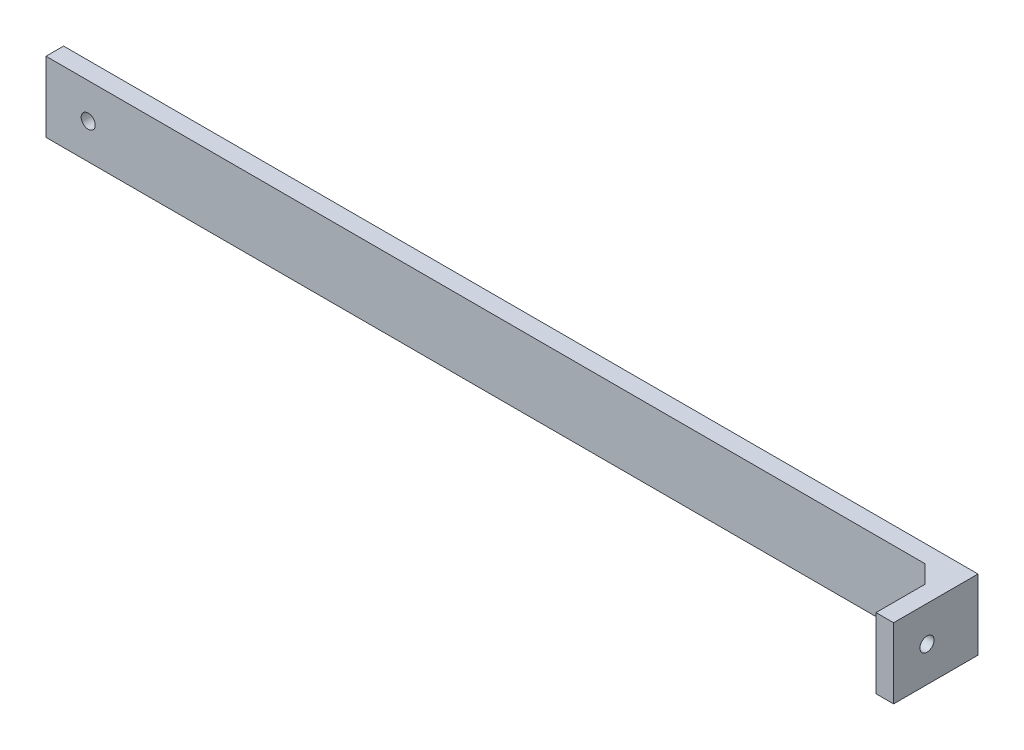
ISO-10303-21;
HEADER;
FILE_DESCRIPTION(('STEP AP214'),'2;1');
FILE_NAME('part.step','',(''),(''),'','','');
FILE_SCHEMA(('AUTOMOTIVE_DESIGN { 1 0 10303 214 1 1 1 1 }'));
ENDSEC;
DATA;
#1=APPLICATION_CONTEXT('core data for automotive mechanical design processes');
#2=APPLICATION_PROTOCOL_DEFINITION('international standard','automotive_design',2000,#1);
#3=PRODUCT_CONTEXT('',#1,'mechanical');
#4=PRODUCT('Part','Part','',(#3));
#5=PRODUCT_RELATED_PRODUCT_CATEGORY('part','',(#4));
#6=PRODUCT_DEFINITION_FORMATION('','',#4);
#7=PRODUCT_DEFINITION_CONTEXT('part definition',#1,'design');
#8=PRODUCT_DEFINITION('design','',#6,#7);
#9=PRODUCT_DEFINITION_SHAPE('','',#8);
#10=(LENGTH_UNIT() NAMED_UNIT(*) SI_UNIT(.MILLI.,.METRE.));
#11=(NAMED_UNIT(*) PLANE_ANGLE_UNIT() SI_UNIT($,.RADIAN.));
#12=(NAMED_UNIT(*) SI_UNIT($,.STERADIAN.) SOLID_ANGLE_UNIT());
#13=UNCERTAINTY_MEASURE_WITH_UNIT(LENGTH_MEASURE(1.E-05),#10,'distance_accuracy_value','');
#14=(GEOMETRIC_REPRESENTATION_CONTEXT(3) GLOBAL_UNCERTAINTY_ASSIGNED_CONTEXT((#13)) GLOBAL_UNIT_ASSIGNED_CONTEXT((#10,
#11,#12)) REPRESENTATION_CONTEXT('',''));
#15=CARTESIAN_POINT('',(0.,0.,0.));
#16=DIRECTION('',(0.,0.,1.));
#17=DIRECTION('',(1.,0.,0.));
#18=AXIS2_PLACEMENT_3D('',#15,#16,#17);
#19=CARTESIAN_POINT('',(0.,0.,5.));
#20=DIRECTION('',(0.,0.,-1.));
#21=DIRECTION('',(-1.,0.,0.));
#22=AXIS2_PLACEMENT_3D('',#19,#20,#21);
#23=PLANE('',#22);
#24=CARTESIAN_POINT('',(-118.,0.,5.));
#25=DIRECTION('',(0.,0.,-1.));
#26=DIRECTION('',(-1.,0.,0.));
#27=AXIS2_PLACEMENT_3D('',#24,#25,#26);
#28=CIRCLE('',#27,2.);
#29=CARTESIAN_POINT('',(-120.,0.,5.));
#30=VERTEX_POINT('',#29);
#31=EDGE_CURVE('E355',#30,#30,#28,.T.);
#32=ORIENTED_EDGE('',*,*,#31,.T.);
#33=EDGE_LOOP('',(#32));
#34=FACE_BOUND('',#33,.T.);
#35=DIRECTION('',(1.,0.,0.));
#36=VECTOR('',#35,1.);
#37=CARTESIAN_POINT('',(120.,5.,5.));
#38=LINE('',#37,#36);
#39=CARTESIAN_POINT('',(120.,5.,5.));
#40=VERTEX_POINT('',#39);
#41=CARTESIAN_POINT('',(125.,5.,5.));
#42=VERTEX_POINT('',#41);
#43=EDGE_CURVE('E201',#40,#42,#38,.T.);
#44=ORIENTED_EDGE('',*,*,#43,.F.);
#45=DIRECTION('',(0.,-1.,0.));
#46=VECTOR('',#45,1.);
#47=CARTESIAN_POINT('',(120.,10.,5.));
#48=LINE('',#47,#46);
#49=CARTESIAN_POINT('',(120.,10.,5.));
#50=VERTEX_POINT('',#49);
#51=EDGE_CURVE('E118',#50,#40,#48,.T.);
#52=ORIENTED_EDGE('',*,*,#51,.F.);
#53=DIRECTION('',(-1.,0.,0.));
#54=VECTOR('',#53,1.);
#55=CARTESIAN_POINT('',(-130.,10.,5.));
#56=LINE('',#55,#54);
#57=CARTESIAN_POINT('',(-130.,10.,5.));
#58=VERTEX_POINT('',#57);
#59=EDGE_CURVE('E128',#50,#58,#56,.T.);
#60=ORIENTED_EDGE('',*,*,#59,.T.);
#61=DIRECTION('',(0.,-1.,0.));
#62=VECTOR('',#61,1.);
#63=CARTESIAN_POINT('',(-130.,-10.,5.));
#64=LINE('',#63,#62);
#65=CARTESIAN_POINT('',(-130.,-10.,5.));
#66=VERTEX_POINT('',#65);
#67=EDGE_CURVE('E148',#58,#66,#64,.T.);
#68=ORIENTED_EDGE('',*,*,#67,.T.);
#69=DIRECTION('',(1.,0.,0.));
#70=VECTOR('',#69,1.);
#71=CARTESIAN_POINT('',(-130.,-10.,5.));
#72=LINE('',#71,#70);
#73=CARTESIAN_POINT('',(120.,-10.,5.));
#74=VERTEX_POINT('',#73);
#75=EDGE_CURVE('E151',#66,#74,#72,.T.);
#76=ORIENTED_EDGE('',*,*,#75,.T.);
#77=DIRECTION('',(0.,-1.,0.));
#78=VECTOR('',#77,1.);
#79=CARTESIAN_POINT('',(120.,-10.,5.));
#80=LINE('',#79,#78);
#81=CARTESIAN_POINT('',(120.,-5.,5.));
#82=VERTEX_POINT('',#81);
#83=EDGE_CURVE('E203',#82,#74,#80,.T.);
#84=ORIENTED_EDGE('',*,*,#83,.F.);
#85=DIRECTION('',(1.,0.,0.));
#86=VECTOR('',#85,1.);
#87=CARTESIAN_POINT('',(120.,-5.,5.));
#88=LINE('',#87,#86);
#89=CARTESIAN_POINT('',(125.,-5.,5.));
#90=VERTEX_POINT('',#89);
#91=EDGE_CURVE('E208',#82,#90,#88,.T.);
#92=ORIENTED_EDGE('',*,*,#91,.T.);
#93=DIRECTION('',(0.,-1.,0.));
#94=VECTOR('',#93,1.);
#95=CARTESIAN_POINT('',(125.,10.,5.));
#96=LINE('',#95,#94);
#97=EDGE_CURVE('E185',#42,#90,#96,.T.);
#98=ORIENTED_EDGE('',*,*,#97,.F.);
#99=EDGE_LOOP('',(#44,#52,#60,#68,#76,#84,#92,#98));
#100=FACE_BOUND('',#99,.T.);
#101=ADVANCED_FACE('F37',(#34,#100),#23,.F.);
#102=CARTESIAN_POINT('',(125.,10.,24.));
#103=DIRECTION('',(1.,0.,0.));
#104=DIRECTION('',(0.,0.,-1.));
#105=AXIS2_PLACEMENT_3D('',#102,#103,#104);
#106=PLANE('',#105);
#107=DIRECTION('',(0.,0.,-1.));
#108=VECTOR('',#107,1.);
#109=CARTESIAN_POINT('',(125.,-5.,5.));
#110=LINE('',#109,#108);
#111=CARTESIAN_POINT('',(125.,-5.,10.));
#112=VERTEX_POINT('',#111);
#113=EDGE_CURVE('E198',#112,#90,#110,.T.);
#114=ORIENTED_EDGE('',*,*,#113,.F.);
#115=DIRECTION('',(0.,1.,0.));
#116=VECTOR('',#115,1.);
#117=CARTESIAN_POINT('',(125.,-10.,10.));
#118=LINE('',#117,#116);
#119=CARTESIAN_POINT('',(125.,-10.,10.));
#120=VERTEX_POINT('',#119);
#121=EDGE_CURVE('E196',#120,#112,#118,.T.);
#122=ORIENTED_EDGE('',*,*,#121,.F.);
#123=DIRECTION('',(0.,0.,-1.));
#124=VECTOR('',#123,1.);
#125=CARTESIAN_POINT('',(125.,-10.,24.));
#126=LINE('',#125,#124);
#127=CARTESIAN_POINT('',(125.,-10.,24.));
#128=VERTEX_POINT('',#127);
#129=EDGE_CURVE('E137',#128,#120,#126,.T.);
#130=ORIENTED_EDGE('',*,*,#129,.F.);
#131=DIRECTION('',(0.,-1.,0.));
#132=VECTOR('',#131,1.);
#133=CARTESIAN_POINT('',(125.,10.,24.));
#134=LINE('',#133,#132);
#135=CARTESIAN_POINT('',(125.,10.,24.));
#136=VERTEX_POINT('',#135);
#137=EDGE_CURVE('E135',#136,#128,#134,.T.);
#138=ORIENTED_EDGE('',*,*,#137,.F.);
#139=DIRECTION('',(0.,0.,-1.));
#140=VECTOR('',#139,1.);
#141=CARTESIAN_POINT('',(125.,10.,24.));
#142=LINE('',#141,#140);
#143=CARTESIAN_POINT('',(125.,10.,10.));
#144=VERTEX_POINT('',#143);
#145=EDGE_CURVE('E125',#136,#144,#142,.T.);
#146=ORIENTED_EDGE('',*,*,#145,.T.);
#147=DIRECTION('',(0.,1.,0.));
#148=VECTOR('',#147,1.);
#149=CARTESIAN_POINT('',(125.,10.,10.));
#150=LINE('',#149,#148);
#151=CARTESIAN_POINT('',(125.,5.,10.));
#152=VERTEX_POINT('',#151);
#153=EDGE_CURVE('E113',#152,#144,#150,.T.);
#154=ORIENTED_EDGE('',*,*,#153,.F.);
#155=DIRECTION('',(0.,0.,1.));
#156=VECTOR('',#155,1.);
#157=CARTESIAN_POINT('',(125.,5.,5.));
#158=LINE('',#157,#156);
#159=EDGE_CURVE('E53',#42,#152,#158,.T.);
#160=ORIENTED_EDGE('',*,*,#159,.F.);
#161=ORIENTED_EDGE('',*,*,#97,.T.);
#162=EDGE_LOOP('',(#114,#122,#130,#138,#146,#154,#160,#161));
#163=FACE_BOUND('',#162,.T.);
#164=CARTESIAN_POINT('',(125.,0.,14.5));
#165=DIRECTION('',(1.,0.,0.));
#166=DIRECTION('',(0.,0.,-1.));
#167=AXIS2_PLACEMENT_3D('',#164,#165,#166);
#168=CIRCLE('',#167,2.);
#169=CARTESIAN_POINT('',(125.,0.,12.5));
#170=VERTEX_POINT('',#169);
#171=EDGE_CURVE('E41',#170,#170,#168,.T.);
#172=ORIENTED_EDGE('',*,*,#171,.T.);
#173=EDGE_LOOP('',(#172));
#174=FACE_BOUND('',#173,.T.);
#175=ADVANCED_FACE('F132',(#163,#174),#106,.F.);
#176=CARTESIAN_POINT('',(130.,-10.,5.));
#177=DIRECTION('',(-1.,0.,0.));
#178=DIRECTION('',(0.,0.,1.));
#179=AXIS2_PLACEMENT_3D('',#176,#177,#178);
#180=PLANE('',#179);
#181=CARTESIAN_POINT('',(130.,0.,14.5));
#182=DIRECTION('',(1.,0.,0.));
#183=DIRECTION('',(0.,0.,-1.));
#184=AXIS2_PLACEMENT_3D('',#181,#182,#183);
#185=CIRCLE('',#184,2.);
#186=CARTESIAN_POINT('',(130.,0.,12.5));
#187=VERTEX_POINT('',#186);
#188=EDGE_CURVE('E189',#187,#187,#185,.T.);
#189=ORIENTED_EDGE('',*,*,#188,.F.);
#190=EDGE_LOOP('',(#189));
#191=FACE_BOUND('',#190,.T.);
#192=DIRECTION('',(0.,1.,0.));
#193=VECTOR('',#192,1.);
#194=CARTESIAN_POINT('',(130.,-10.,0.));
#195=LINE('',#194,#193);
#196=CARTESIAN_POINT('',(130.,-10.,0.));
#197=VERTEX_POINT('',#196);
#198=CARTESIAN_POINT('',(130.,10.,0.));
#199=VERTEX_POINT('',#198);
#200=EDGE_CURVE('E136',#197,#199,#195,.T.);
#201=ORIENTED_EDGE('',*,*,#200,.T.);
#202=DIRECTION('',(0.,0.,-1.));
#203=VECTOR('',#202,1.);
#204=CARTESIAN_POINT('',(130.,10.,5.));
#205=LINE('',#204,#203);
#206=CARTESIAN_POINT('',(130.,10.,24.));
#207=VERTEX_POINT('',#206);
#208=EDGE_CURVE('E11',#207,#199,#205,.T.);
#209=ORIENTED_EDGE('',*,*,#208,.F.);
#210=DIRECTION('',(0.,1.,0.));
#211=VECTOR('',#210,1.);
#212=CARTESIAN_POINT('',(130.,10.,24.));
#213=LINE('',#212,#211);
#214=CARTESIAN_POINT('',(130.,-10.,24.));
#215=VERTEX_POINT('',#214);
#216=EDGE_CURVE('E182',#215,#207,#213,.T.);
#217=ORIENTED_EDGE('',*,*,#216,.F.);
#218=DIRECTION('',(0.,0.,-1.));
#219=VECTOR('',#218,1.);
#220=CARTESIAN_POINT('',(130.,-10.,5.));
#221=LINE('',#220,#219);
#222=EDGE_CURVE('E153',#215,#197,#221,.T.);
#223=ORIENTED_EDGE('',*,*,#222,.T.);
#224=EDGE_LOOP('',(#201,#209,#217,#223));
#225=FACE_BOUND('',#224,.T.);
#226=ADVANCED_FACE('F39',(#191,#225),#180,.F.);
#227=CARTESIAN_POINT('',(-130.,10.,5.));
#228=DIRECTION('',(0.,-1.,0.));
#229=DIRECTION('',(0.,0.,-1.));
#230=AXIS2_PLACEMENT_3D('',#227,#228,#229);
#231=PLANE('',#230);
#232=ORIENTED_EDGE('',*,*,#59,.F.);
#233=DIRECTION('',(0.707106781186548,0.,0.707106781186547));
#234=VECTOR('',#233,1.);
#235=CARTESIAN_POINT('',(120.,10.,5.));
#236=LINE('',#235,#234);
#237=EDGE_CURVE('E61',#50,#144,#236,.T.);
#238=ORIENTED_EDGE('',*,*,#237,.T.);
#239=ORIENTED_EDGE('',*,*,#145,.F.);
#240=DIRECTION('',(-1.,0.,0.));
#241=VECTOR('',#240,1.);
#242=CARTESIAN_POINT('',(130.,10.,24.));
#243=LINE('',#242,#241);
#244=EDGE_CURVE('E184',#207,#136,#243,.T.);
#245=ORIENTED_EDGE('',*,*,#244,.F.);
#246=ORIENTED_EDGE('',*,*,#208,.T.);
#247=DIRECTION('',(-1.,0.,0.));
#248=VECTOR('',#247,1.);
#249=CARTESIAN_POINT('',(-130.,10.,0.));
#250=LINE('',#249,#248);
#251=CARTESIAN_POINT('',(-130.,10.,0.));
#252=VERTEX_POINT('',#251);
#253=EDGE_CURVE('E140',#199,#252,#250,.T.);
#254=ORIENTED_EDGE('',*,*,#253,.T.);
#255=DIRECTION('',(0.,0.,-1.));
#256=VECTOR('',#255,1.);
#257=CARTESIAN_POINT('',(-130.,10.,5.));
#258=LINE('',#257,#256);
#259=EDGE_CURVE('E46',#58,#252,#258,.T.);
#260=ORIENTED_EDGE('',*,*,#259,.F.);
#261=EDGE_LOOP('',(#232,#238,#239,#245,#246,#254,#260));
#262=FACE_BOUND('',#261,.T.);
#263=ADVANCED_FACE('F123',(#262),#231,.F.);
#264=CARTESIAN_POINT('',(-130.,-10.,5.));
#265=DIRECTION('',(1.,0.,0.));
#266=DIRECTION('',(0.,0.,-1.));
#267=AXIS2_PLACEMENT_3D('',#264,#265,#266);
#268=PLANE('',#267);
#269=DIRECTION('',(0.,-1.,0.));
#270=VECTOR('',#269,1.);
#271=CARTESIAN_POINT('',(-130.,-10.,0.));
#272=LINE('',#271,#270);
#273=CARTESIAN_POINT('',(-130.,-10.,0.));
#274=VERTEX_POINT('',#273);
#275=EDGE_CURVE('E156',#252,#274,#272,.T.);
#276=ORIENTED_EDGE('',*,*,#275,.T.);
#277=DIRECTION('',(0.,0.,-1.));
#278=VECTOR('',#277,1.);
#279=CARTESIAN_POINT('',(-130.,-10.,5.));
#280=LINE('',#279,#278);
#281=EDGE_CURVE('E161',#66,#274,#280,.T.);
#282=ORIENTED_EDGE('',*,*,#281,.F.);
#283=ORIENTED_EDGE('',*,*,#67,.F.);
#284=ORIENTED_EDGE('',*,*,#259,.T.);
#285=EDGE_LOOP('',(#276,#282,#283,#284));
#286=FACE_BOUND('',#285,.T.);
#287=ADVANCED_FACE('F168',(#286),#268,.F.);
#288=CARTESIAN_POINT('',(-130.,-10.,5.));
#289=DIRECTION('',(0.,1.,0.));
#290=DIRECTION('',(0.,0.,1.));
#291=AXIS2_PLACEMENT_3D('',#288,#289,#290);
#292=PLANE('',#291);
#293=ORIENTED_EDGE('',*,*,#129,.T.);
#294=DIRECTION('',(0.707106781186548,0.,0.707106781186547));
#295=VECTOR('',#294,1.);
#296=CARTESIAN_POINT('',(120.,-10.,5.));
#297=LINE('',#296,#295);
#298=EDGE_CURVE('E129',#74,#120,#297,.T.);
#299=ORIENTED_EDGE('',*,*,#298,.F.);
#300=ORIENTED_EDGE('',*,*,#75,.F.);
#301=ORIENTED_EDGE('',*,*,#281,.T.);
#302=DIRECTION('',(1.,0.,0.));
#303=VECTOR('',#302,1.);
#304=CARTESIAN_POINT('',(-130.,-10.,0.));
#305=LINE('',#304,#303);
#306=EDGE_CURVE('E149',#274,#197,#305,.T.);
#307=ORIENTED_EDGE('',*,*,#306,.T.);
#308=ORIENTED_EDGE('',*,*,#222,.F.);
#309=DIRECTION('',(1.,0.,0.));
#310=VECTOR('',#309,1.);
#311=CARTESIAN_POINT('',(130.,-10.,24.));
#312=LINE('',#311,#310);
#313=EDGE_CURVE('E143',#128,#215,#312,.T.);
#314=ORIENTED_EDGE('',*,*,#313,.F.);
#315=EDGE_LOOP('',(#293,#299,#300,#301,#307,#308,#314));
#316=FACE_BOUND('',#315,.T.);
#317=ADVANCED_FACE('F175',(#316),#292,.F.);
#318=CARTESIAN_POINT('',(0.,0.,0.));
#319=DIRECTION('',(0.,0.,-1.));
#320=DIRECTION('',(-1.,0.,0.));
#321=AXIS2_PLACEMENT_3D('',#318,#319,#320);
#322=PLANE('',#321);
#323=CARTESIAN_POINT('',(-118.,0.,0.));
#324=DIRECTION('',(0.,0.,-1.));
#325=DIRECTION('',(-1.,0.,0.));
#326=AXIS2_PLACEMENT_3D('',#323,#324,#325);
#327=CIRCLE('',#326,2.);
#328=CARTESIAN_POINT('',(-120.,0.,0.));
#329=VERTEX_POINT('',#328);
#330=EDGE_CURVE('E353',#329,#329,#327,.T.);
#331=ORIENTED_EDGE('',*,*,#330,.F.);
#332=EDGE_LOOP('',(#331));
#333=FACE_BOUND('',#332,.T.);
#334=ORIENTED_EDGE('',*,*,#200,.F.);
#335=ORIENTED_EDGE('',*,*,#306,.F.);
#336=ORIENTED_EDGE('',*,*,#275,.F.);
#337=ORIENTED_EDGE('',*,*,#253,.F.);
#338=EDGE_LOOP('',(#334,#335,#336,#337));
#339=FACE_BOUND('',#338,.T.);
#340=ADVANCED_FACE('F173',(#333,#339),#322,.T.);
#341=CARTESIAN_POINT('',(0.,0.,24.));
#342=DIRECTION('',(0.,0.,-1.));
#343=DIRECTION('',(-1.,0.,0.));
#344=AXIS2_PLACEMENT_3D('',#341,#342,#343);
#345=PLANE('',#344);
#346=ORIENTED_EDGE('',*,*,#216,.T.);
#347=ORIENTED_EDGE('',*,*,#244,.T.);
#348=ORIENTED_EDGE('',*,*,#137,.T.);
#349=ORIENTED_EDGE('',*,*,#313,.T.);
#350=EDGE_LOOP('',(#346,#347,#348,#349));
#351=FACE_BOUND('',#350,.T.);
#352=ADVANCED_FACE('F193',(#351),#345,.F.);
#353=CARTESIAN_POINT('',(-130.,0.,14.5));
#354=DIRECTION('',(1.,0.,0.));
#355=DIRECTION('',(0.,0.,-1.));
#356=AXIS2_PLACEMENT_3D('',#353,#354,#355);
#357=CYLINDRICAL_SURFACE('',#356,2.);
#358=ORIENTED_EDGE('',*,*,#188,.T.);
#359=EDGE_LOOP('',(#358));
#360=FACE_BOUND('',#359,.T.);
#361=ORIENTED_EDGE('',*,*,#171,.F.);
#362=EDGE_LOOP('',(#361));
#363=FACE_BOUND('',#362,.T.);
#364=ADVANCED_FACE('F233',(#360,#363),#357,.F.);
#365=CARTESIAN_POINT('',(120.,-5.,5.));
#366=DIRECTION('',(0.,-1.,0.));
#367=DIRECTION('',(0.,0.,-1.));
#368=AXIS2_PLACEMENT_3D('',#365,#366,#367);
#369=PLANE('',#368);
#370=ORIENTED_EDGE('',*,*,#91,.F.);
#371=DIRECTION('',(0.707106781186548,0.,0.707106781186547));
#372=VECTOR('',#371,1.);
#373=CARTESIAN_POINT('',(120.,-5.,5.));
#374=LINE('',#373,#372);
#375=EDGE_CURVE('E215',#82,#112,#374,.T.);
#376=ORIENTED_EDGE('',*,*,#375,.T.);
#377=ORIENTED_EDGE('',*,*,#113,.T.);
#378=EDGE_LOOP('',(#370,#376,#377));
#379=FACE_BOUND('',#378,.T.);
#380=ADVANCED_FACE('F218',(#379),#369,.F.);
#381=CARTESIAN_POINT('',(120.,5.,5.));
#382=DIRECTION('',(0.,1.,0.));
#383=DIRECTION('',(0.,0.,1.));
#384=AXIS2_PLACEMENT_3D('',#381,#382,#383);
#385=PLANE('',#384);
#386=ORIENTED_EDGE('',*,*,#159,.T.);
#387=DIRECTION('',(-0.707106781186548,0.,-0.707106781186547));
#388=VECTOR('',#387,1.);
#389=CARTESIAN_POINT('',(120.,5.,5.));
#390=LINE('',#389,#388);
#391=EDGE_CURVE('E116',#152,#40,#390,.T.);
#392=ORIENTED_EDGE('',*,*,#391,.T.);
#393=ORIENTED_EDGE('',*,*,#43,.T.);
#394=EDGE_LOOP('',(#386,#392,#393));
#395=FACE_BOUND('',#394,.T.);
#396=ADVANCED_FACE('F225',(#395),#385,.F.);
#397=CARTESIAN_POINT('',(120.,10.,5.));
#398=DIRECTION('',(0.707106781186547,0.,-0.707106781186548));
#399=DIRECTION('',(-0.707106781186548,0.,-0.707106781186547));
#400=AXIS2_PLACEMENT_3D('',#397,#398,#399);
#401=PLANE('',#400);
#402=ORIENTED_EDGE('',*,*,#153,.T.);
#403=ORIENTED_EDGE('',*,*,#237,.F.);
#404=ORIENTED_EDGE('',*,*,#51,.T.);
#405=ORIENTED_EDGE('',*,*,#391,.F.);
#406=EDGE_LOOP('',(#402,#403,#404,#405));
#407=FACE_BOUND('',#406,.T.);
#408=ADVANCED_FACE('F114',(#407),#401,.F.);
#409=ORIENTED_EDGE('',*,*,#83,.T.);
#410=ORIENTED_EDGE('',*,*,#298,.T.);
#411=ORIENTED_EDGE('',*,*,#121,.T.);
#412=ORIENTED_EDGE('',*,*,#375,.F.);
#413=EDGE_LOOP('',(#409,#410,#411,#412));
#414=FACE_BOUND('',#413,.T.);
#415=ADVANCED_FACE('F214',(#414),#401,.F.);
#416=CARTESIAN_POINT('',(-118.,0.,24.));
#417=DIRECTION('',(0.,0.,-1.));
#418=DIRECTION('',(-1.,0.,0.));
#419=AXIS2_PLACEMENT_3D('',#416,#417,#418);
#420=CYLINDRICAL_SURFACE('',#419,2.);
#421=ORIENTED_EDGE('',*,*,#330,.T.);
#422=EDGE_LOOP('',(#421));
#423=FACE_BOUND('',#422,.T.);
#424=ORIENTED_EDGE('',*,*,#31,.F.);
#425=EDGE_LOOP('',(#424));
#426=FACE_BOUND('',#425,.T.);
#427=ADVANCED_FACE('F339',(#423,#426),#420,.F.);
#428=CLOSED_SHELL('',(#101,#175,#226,#263,#287,#317,#340,#352,#364,#380,#396,#408,#415,#427));
#429=MANIFOLD_SOLID_BREP('B2',#428);
#430=ADVANCED_BREP_SHAPE_REPRESENTATION('',(#18,#429),#14);
#431=SHAPE_DEFINITION_REPRESENTATION(#9,#430);
ENDSEC;
END-ISO-10303-21;
